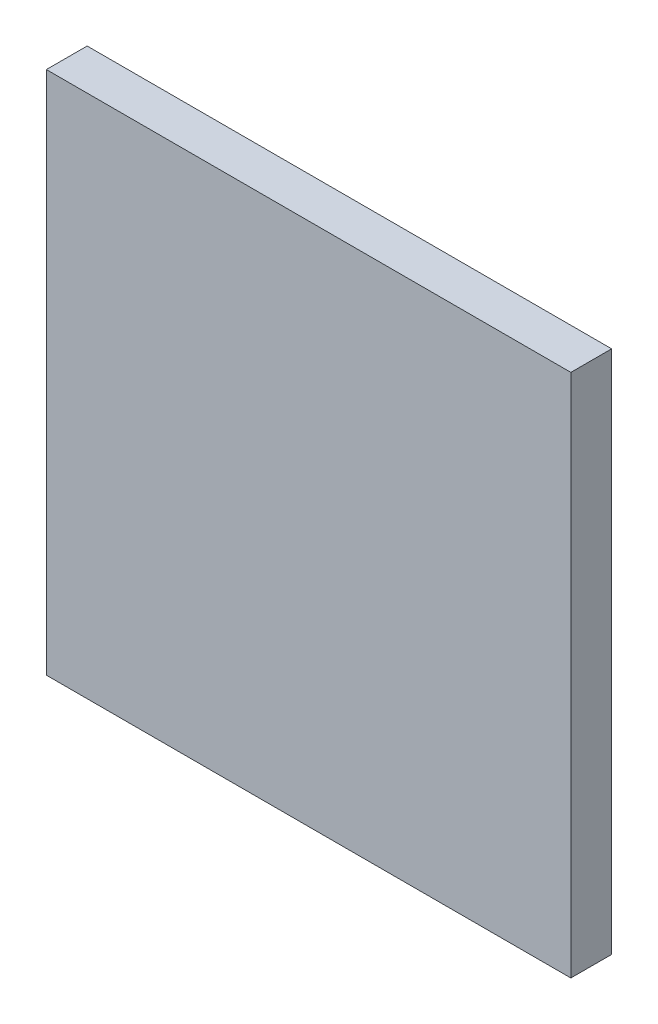
ISO-10303-21;
HEADER;
FILE_DESCRIPTION(('STEP AP214'),'2;1');
FILE_NAME('part.step','',(''),(''),'','','');
FILE_SCHEMA(('AUTOMOTIVE_DESIGN { 1 0 10303 214 1 1 1 1 }'));
ENDSEC;
DATA;
#1=APPLICATION_CONTEXT('core data for automotive mechanical design processes');
#2=APPLICATION_PROTOCOL_DEFINITION('international standard','automotive_design',2000,#1);
#3=PRODUCT_CONTEXT('',#1,'mechanical');
#4=PRODUCT('Part','Part','',(#3));
#5=PRODUCT_RELATED_PRODUCT_CATEGORY('part','',(#4));
#6=PRODUCT_DEFINITION_FORMATION('','',#4);
#7=PRODUCT_DEFINITION_CONTEXT('part definition',#1,'design');
#8=PRODUCT_DEFINITION('design','',#6,#7);
#9=PRODUCT_DEFINITION_SHAPE('','',#8);
#10=(LENGTH_UNIT() NAMED_UNIT(*) SI_UNIT(.MILLI.,.METRE.));
#11=(NAMED_UNIT(*) PLANE_ANGLE_UNIT() SI_UNIT($,.RADIAN.));
#12=(NAMED_UNIT(*) SI_UNIT($,.STERADIAN.) SOLID_ANGLE_UNIT());
#13=UNCERTAINTY_MEASURE_WITH_UNIT(LENGTH_MEASURE(1.E-05),#10,'distance_accuracy_value','');
#14=(GEOMETRIC_REPRESENTATION_CONTEXT(3) GLOBAL_UNCERTAINTY_ASSIGNED_CONTEXT((#13)) GLOBAL_UNIT_ASSIGNED_CONTEXT((#10,
#11,#12)) REPRESENTATION_CONTEXT('',''));
#15=CARTESIAN_POINT('',(0.,0.,0.));
#16=DIRECTION('',(0.,0.,1.));
#17=DIRECTION('',(1.,0.,0.));
#18=AXIS2_PLACEMENT_3D('',#15,#16,#17);
#19=CARTESIAN_POINT('',(0.,0.,-14.0000000000002));
#20=DIRECTION('',(-1.,0.,0.));
#21=DIRECTION('',(0.,-0.999999999999996,0.));
#22=AXIS2_PLACEMENT_3D('',#19,#20,#21);
#23=PLANE('',#22);
#24=DIRECTION('',(0.,-0.999999999999996,0.));
#25=VECTOR('',#24,1.);
#26=CARTESIAN_POINT('',(0.,0.,0.));
#27=LINE('',#26,#25);
#28=CARTESIAN_POINT('',(0.,0.,0.));
#29=VERTEX_POINT('',#28);
#30=CARTESIAN_POINT('',(0.,-180.,0.));
#31=VERTEX_POINT('',#30);
#32=EDGE_CURVE('E100',#29,#31,#27,.T.);
#33=ORIENTED_EDGE('',*,*,#32,.F.);
#34=DIRECTION('',(0.,0.,1.));
#35=VECTOR('',#34,1.);
#36=CARTESIAN_POINT('',(0.,0.,-14.0000000000002));
#37=LINE('',#36,#35);
#38=CARTESIAN_POINT('',(0.,0.,-14.0000000000002));
#39=VERTEX_POINT('',#38);
#40=EDGE_CURVE('E11',#39,#29,#37,.T.);
#41=ORIENTED_EDGE('',*,*,#40,.F.);
#42=DIRECTION('',(0.,-0.999999999999996,0.));
#43=VECTOR('',#42,1.);
#44=CARTESIAN_POINT('',(0.,0.,-14.0000000000002));
#45=LINE('',#44,#43);
#46=CARTESIAN_POINT('',(0.,-180.,-14.0000000000002));
#47=VERTEX_POINT('',#46);
#48=EDGE_CURVE('E94',#39,#47,#45,.T.);
#49=ORIENTED_EDGE('',*,*,#48,.T.);
#50=DIRECTION('',(0.,0.,1.));
#51=VECTOR('',#50,1.);
#52=CARTESIAN_POINT('',(0.,-180.,-14.0000000000002));
#53=LINE('',#52,#51);
#54=EDGE_CURVE('E39',#47,#31,#53,.T.);
#55=ORIENTED_EDGE('',*,*,#54,.T.);
#56=EDGE_LOOP('',(#33,#41,#49,#55));
#57=FACE_BOUND('',#56,.T.);
#58=ADVANCED_FACE('F36',(#57),#23,.T.);
#59=CARTESIAN_POINT('',(0.,0.,-14.0000000000002));
#60=DIRECTION('',(0.,0.999999999999996,0.));
#61=DIRECTION('',(0.,0.,1.));
#62=AXIS2_PLACEMENT_3D('',#59,#60,#61);
#63=PLANE('',#62);
#64=DIRECTION('',(-1.,0.,0.));
#65=VECTOR('',#64,1.);
#66=CARTESIAN_POINT('',(0.,0.,0.));
#67=LINE('',#66,#65);
#68=CARTESIAN_POINT('',(180.,0.,0.));
#69=VERTEX_POINT('',#68);
#70=EDGE_CURVE('E96',#69,#29,#67,.T.);
#71=ORIENTED_EDGE('',*,*,#70,.F.);
#72=DIRECTION('',(0.,0.,1.));
#73=VECTOR('',#72,1.);
#74=CARTESIAN_POINT('',(180.,0.,-14.0000000000002));
#75=LINE('',#74,#73);
#76=CARTESIAN_POINT('',(180.,0.,-14.0000000000002));
#77=VERTEX_POINT('',#76);
#78=EDGE_CURVE('E45',#77,#69,#75,.T.);
#79=ORIENTED_EDGE('',*,*,#78,.F.);
#80=DIRECTION('',(-1.,0.,0.));
#81=VECTOR('',#80,1.);
#82=CARTESIAN_POINT('',(0.,0.,-14.0000000000002));
#83=LINE('',#82,#81);
#84=EDGE_CURVE('E91',#77,#39,#83,.T.);
#85=ORIENTED_EDGE('',*,*,#84,.T.);
#86=ORIENTED_EDGE('',*,*,#40,.T.);
#87=EDGE_LOOP('',(#71,#79,#85,#86));
#88=FACE_BOUND('',#87,.T.);
#89=ADVANCED_FACE('F110',(#88),#63,.T.);
#90=CARTESIAN_POINT('',(180.,0.,-14.0000000000002));
#91=DIRECTION('',(1.,0.,0.));
#92=DIRECTION('',(0.,0.,-1.));
#93=AXIS2_PLACEMENT_3D('',#90,#91,#92);
#94=PLANE('',#93);
#95=DIRECTION('',(0.,0.999999999999996,0.));
#96=VECTOR('',#95,1.);
#97=CARTESIAN_POINT('',(180.,0.,0.));
#98=LINE('',#97,#96);
#99=CARTESIAN_POINT('',(180.,-180.,0.));
#100=VERTEX_POINT('',#99);
#101=EDGE_CURVE('E86',#100,#69,#98,.T.);
#102=ORIENTED_EDGE('',*,*,#101,.F.);
#103=DIRECTION('',(0.,0.,1.));
#104=VECTOR('',#103,1.);
#105=CARTESIAN_POINT('',(180.,-180.,-14.0000000000002));
#106=LINE('',#105,#104);
#107=CARTESIAN_POINT('',(180.,-180.,-14.0000000000002));
#108=VERTEX_POINT('',#107);
#109=EDGE_CURVE('E81',#108,#100,#106,.T.);
#110=ORIENTED_EDGE('',*,*,#109,.F.);
#111=DIRECTION('',(0.,0.999999999999996,0.));
#112=VECTOR('',#111,1.);
#113=CARTESIAN_POINT('',(180.,0.,-14.0000000000002));
#114=LINE('',#113,#112);
#115=EDGE_CURVE('E84',#108,#77,#114,.T.);
#116=ORIENTED_EDGE('',*,*,#115,.T.);
#117=ORIENTED_EDGE('',*,*,#78,.T.);
#118=EDGE_LOOP('',(#102,#110,#116,#117));
#119=FACE_BOUND('',#118,.T.);
#120=ADVANCED_FACE('F83',(#119),#94,.T.);
#121=CARTESIAN_POINT('',(0.,-180.,-14.0000000000002));
#122=DIRECTION('',(0.,-0.999999999999996,0.));
#123=DIRECTION('',(0.,0.,-1.));
#124=AXIS2_PLACEMENT_3D('',#121,#122,#123);
#125=PLANE('',#124);
#126=DIRECTION('',(1.,0.,0.));
#127=VECTOR('',#126,1.);
#128=CARTESIAN_POINT('',(0.,-180.,0.));
#129=LINE('',#128,#127);
#130=EDGE_CURVE('E103',#31,#100,#129,.T.);
#131=ORIENTED_EDGE('',*,*,#130,.F.);
#132=ORIENTED_EDGE('',*,*,#54,.F.);
#133=DIRECTION('',(1.,0.,0.));
#134=VECTOR('',#133,1.);
#135=CARTESIAN_POINT('',(0.,-180.,-14.0000000000002));
#136=LINE('',#135,#134);
#137=EDGE_CURVE('E90',#47,#108,#136,.T.);
#138=ORIENTED_EDGE('',*,*,#137,.T.);
#139=ORIENTED_EDGE('',*,*,#109,.T.);
#140=EDGE_LOOP('',(#131,#132,#138,#139));
#141=FACE_BOUND('',#140,.T.);
#142=ADVANCED_FACE('F93',(#141),#125,.T.);
#143=CARTESIAN_POINT('',(0.,0.,-14.0000000000002));
#144=DIRECTION('',(0.,0.,1.));
#145=DIRECTION('',(1.,0.,0.));
#146=AXIS2_PLACEMENT_3D('',#143,#144,#145);
#147=PLANE('',#146);
#148=ORIENTED_EDGE('',*,*,#48,.F.);
#149=ORIENTED_EDGE('',*,*,#84,.F.);
#150=ORIENTED_EDGE('',*,*,#115,.F.);
#151=ORIENTED_EDGE('',*,*,#137,.F.);
#152=EDGE_LOOP('',(#148,#149,#150,#151));
#153=FACE_BOUND('',#152,.T.);
#154=ADVANCED_FACE('F89',(#153),#147,.F.);
#155=CARTESIAN_POINT('',(0.,0.,0.));
#156=DIRECTION('',(0.,0.,1.));
#157=DIRECTION('',(1.,0.,0.));
#158=AXIS2_PLACEMENT_3D('',#155,#156,#157);
#159=PLANE('',#158);
#160=ORIENTED_EDGE('',*,*,#32,.T.);
#161=ORIENTED_EDGE('',*,*,#130,.T.);
#162=ORIENTED_EDGE('',*,*,#101,.T.);
#163=ORIENTED_EDGE('',*,*,#70,.T.);
#164=EDGE_LOOP('',(#160,#161,#162,#163));
#165=FACE_BOUND('',#164,.T.);
#166=ADVANCED_FACE('F109',(#165),#159,.T.);
#167=CLOSED_SHELL('',(#58,#89,#120,#142,#154,#166));
#168=MANIFOLD_SOLID_BREP('B2',#167);
#169=ADVANCED_BREP_SHAPE_REPRESENTATION('',(#18,#168),#14);
#170=SHAPE_DEFINITION_REPRESENTATION(#9,#169);
ENDSEC;
END-ISO-10303-21;
